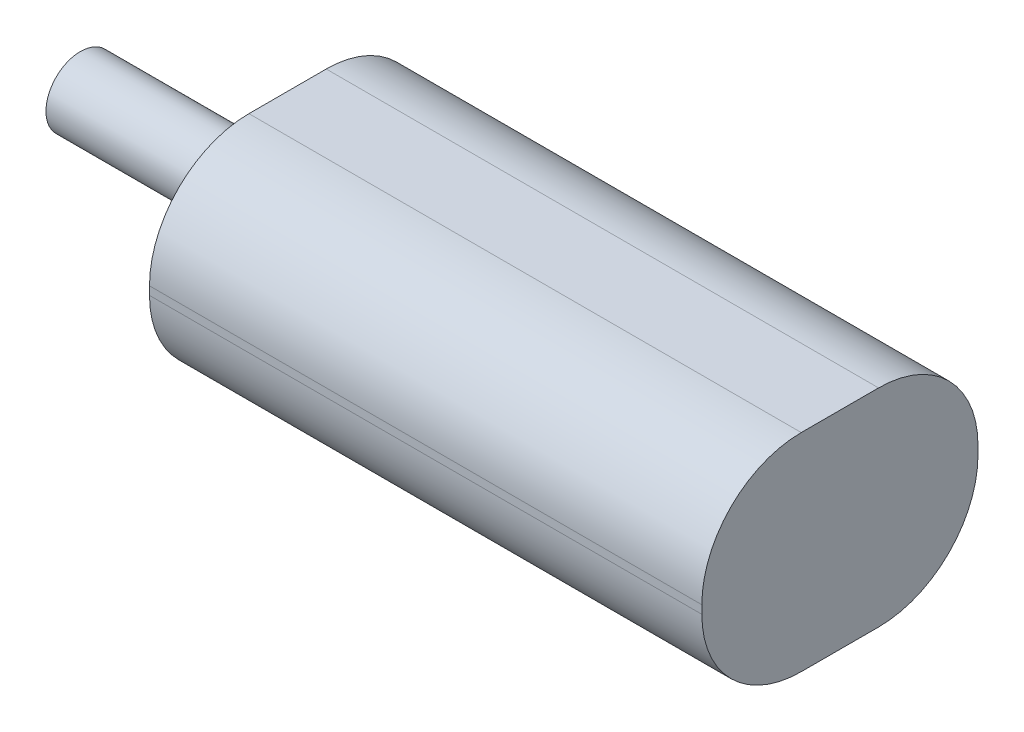
ISO-10303-21;
HEADER;
FILE_DESCRIPTION(('STEP AP214'),'2;1');
FILE_NAME('part.step','',(''),(''),'','','');
FILE_SCHEMA(('AUTOMOTIVE_DESIGN { 1 0 10303 214 1 1 1 1 }'));
ENDSEC;
DATA;
#1=APPLICATION_CONTEXT('core data for automotive mechanical design processes');
#2=APPLICATION_PROTOCOL_DEFINITION('international standard','automotive_design',2000,#1);
#3=PRODUCT_CONTEXT('',#1,'mechanical');
#4=PRODUCT('Part','Part','',(#3));
#5=PRODUCT_RELATED_PRODUCT_CATEGORY('part','',(#4));
#6=PRODUCT_DEFINITION_FORMATION('','',#4);
#7=PRODUCT_DEFINITION_CONTEXT('part definition',#1,'design');
#8=PRODUCT_DEFINITION('design','',#6,#7);
#9=PRODUCT_DEFINITION_SHAPE('','',#8);
#10=(LENGTH_UNIT() NAMED_UNIT(*) SI_UNIT(.MILLI.,.METRE.));
#11=(NAMED_UNIT(*) PLANE_ANGLE_UNIT() SI_UNIT($,.RADIAN.));
#12=(NAMED_UNIT(*) SI_UNIT($,.STERADIAN.) SOLID_ANGLE_UNIT());
#13=UNCERTAINTY_MEASURE_WITH_UNIT(LENGTH_MEASURE(1.E-05),#10,'distance_accuracy_value','');
#14=(GEOMETRIC_REPRESENTATION_CONTEXT(3) GLOBAL_UNCERTAINTY_ASSIGNED_CONTEXT((#13)) GLOBAL_UNIT_ASSIGNED_CONTEXT((#10,
#11,#12)) REPRESENTATION_CONTEXT('',''));
#15=CARTESIAN_POINT('',(0.,0.,0.));
#16=DIRECTION('',(0.,0.,1.));
#17=DIRECTION('',(1.,0.,0.));
#18=AXIS2_PLACEMENT_3D('',#15,#16,#17);
#19=CARTESIAN_POINT('',(0.,9.525,0.));
#20=DIRECTION('',(1.,0.,0.));
#21=DIRECTION('',(0.,0.,-1.));
#22=AXIS2_PLACEMENT_3D('',#19,#20,#21);
#23=PLANE('',#22);
#24=CARTESIAN_POINT('',(0.,4.7625,-6.35));
#25=DIRECTION('',(-1.,0.,0.));
#26=DIRECTION('',(0.,0.,1.));
#27=AXIS2_PLACEMENT_3D('',#24,#25,#26);
#28=CIRCLE('',#27,1.5875);
#29=CARTESIAN_POINT('',(0.,4.7625,-7.9375));
#30=VERTEX_POINT('',#29);
#31=EDGE_CURVE('E139',#30,#30,#28,.T.);
#32=ORIENTED_EDGE('',*,*,#31,.F.);
#33=EDGE_LOOP('',(#32));
#34=FACE_BOUND('',#33,.T.);
#35=DIRECTION('',(0.,0.,1.));
#36=VECTOR('',#35,1.);
#37=CARTESIAN_POINT('',(0.,0.,0.));
#38=LINE('',#37,#36);
#39=CARTESIAN_POINT('',(0.,0.,-8.128));
#40=VERTEX_POINT('',#39);
#41=CARTESIAN_POINT('',(0.,0.,-4.572));
#42=VERTEX_POINT('',#41);
#43=EDGE_CURVE('E190',#40,#42,#38,.T.);
#44=ORIENTED_EDGE('',*,*,#43,.T.);
#45=CARTESIAN_POINT('',(0.,4.572,-4.572));
#46=DIRECTION('',(1.,0.,0.));
#47=DIRECTION('',(0.,0.,-1.));
#48=AXIS2_PLACEMENT_3D('',#45,#46,#47);
#49=CIRCLE('',#48,4.572);
#50=CARTESIAN_POINT('',(0.,4.572,0.));
#51=VERTEX_POINT('',#50);
#52=EDGE_CURVE('E168',#42,#51,#49,.F.);
#53=ORIENTED_EDGE('',*,*,#52,.T.);
#54=DIRECTION('',(0.,-1.,0.));
#55=VECTOR('',#54,1.);
#56=CARTESIAN_POINT('',(0.,9.525,0.));
#57=LINE('',#56,#55);
#58=CARTESIAN_POINT('',(0.,4.953,0.));
#59=VERTEX_POINT('',#58);
#60=EDGE_CURVE('E133',#59,#51,#57,.T.);
#61=ORIENTED_EDGE('',*,*,#60,.F.);
#62=CARTESIAN_POINT('',(0.,4.953,-4.572));
#63=DIRECTION('',(1.,0.,0.));
#64=DIRECTION('',(0.,0.,-1.));
#65=AXIS2_PLACEMENT_3D('',#62,#63,#64);
#66=CIRCLE('',#65,4.572);
#67=CARTESIAN_POINT('',(0.,9.525,-4.572));
#68=VERTEX_POINT('',#67);
#69=EDGE_CURVE('E137',#59,#68,#66,.F.);
#70=ORIENTED_EDGE('',*,*,#69,.T.);
#71=DIRECTION('',(0.,0.,1.));
#72=VECTOR('',#71,1.);
#73=CARTESIAN_POINT('',(0.,9.525,0.));
#74=LINE('',#73,#72);
#75=CARTESIAN_POINT('',(0.,9.525,-8.128));
#76=VERTEX_POINT('',#75);
#77=EDGE_CURVE('E181',#76,#68,#74,.T.);
#78=ORIENTED_EDGE('',*,*,#77,.F.);
#79=CARTESIAN_POINT('',(0.,4.953,-8.128));
#80=DIRECTION('',(1.,0.,0.));
#81=DIRECTION('',(0.,0.,-1.));
#82=AXIS2_PLACEMENT_3D('',#79,#80,#81);
#83=CIRCLE('',#82,4.572);
#84=CARTESIAN_POINT('',(0.,4.953,-12.7));
#85=VERTEX_POINT('',#84);
#86=EDGE_CURVE('E67',#76,#85,#83,.F.);
#87=ORIENTED_EDGE('',*,*,#86,.T.);
#88=DIRECTION('',(0.,-1.,0.));
#89=VECTOR('',#88,1.);
#90=CARTESIAN_POINT('',(0.,9.525,-12.7));
#91=LINE('',#90,#89);
#92=CARTESIAN_POINT('',(0.,4.572,-12.7));
#93=VERTEX_POINT('',#92);
#94=EDGE_CURVE('E187',#85,#93,#91,.T.);
#95=ORIENTED_EDGE('',*,*,#94,.T.);
#96=CARTESIAN_POINT('',(0.,4.572,-8.128));
#97=DIRECTION('',(1.,0.,0.));
#98=DIRECTION('',(0.,0.,-1.));
#99=AXIS2_PLACEMENT_3D('',#96,#97,#98);
#100=CIRCLE('',#99,4.572);
#101=EDGE_CURVE('E59',#93,#40,#100,.F.);
#102=ORIENTED_EDGE('',*,*,#101,.T.);
#103=EDGE_LOOP('',(#44,#53,#61,#70,#78,#87,#95,#102));
#104=FACE_BOUND('',#103,.T.);
#105=ADVANCED_FACE('F43',(#34,#104),#23,.F.);
#106=CARTESIAN_POINT('',(0.,9.525,0.));
#107=DIRECTION('',(0.,0.,-1.));
#108=DIRECTION('',(-1.,0.,0.));
#109=AXIS2_PLACEMENT_3D('',#106,#107,#108);
#110=PLANE('',#109);
#111=ORIENTED_EDGE('',*,*,#60,.T.);
#112=DIRECTION('',(1.,0.,0.));
#113=VECTOR('',#112,1.);
#114=CARTESIAN_POINT('',(25.4,4.572,0.));
#115=LINE('',#114,#113);
#116=CARTESIAN_POINT('',(25.4,4.572,0.));
#117=VERTEX_POINT('',#116);
#118=EDGE_CURVE('E123',#51,#117,#115,.T.);
#119=ORIENTED_EDGE('',*,*,#118,.T.);
#120=DIRECTION('',(0.,-1.,0.));
#121=VECTOR('',#120,1.);
#122=CARTESIAN_POINT('',(25.4,9.525,0.));
#123=LINE('',#122,#121);
#124=CARTESIAN_POINT('',(25.4,4.953,0.));
#125=VERTEX_POINT('',#124);
#126=EDGE_CURVE('E114',#125,#117,#123,.T.);
#127=ORIENTED_EDGE('',*,*,#126,.F.);
#128=DIRECTION('',(1.,0.,0.));
#129=VECTOR('',#128,1.);
#130=CARTESIAN_POINT('',(0.,4.953,0.));
#131=LINE('',#130,#129);
#132=EDGE_CURVE('E129',#125,#59,#131,.F.);
#133=ORIENTED_EDGE('',*,*,#132,.T.);
#134=EDGE_LOOP('',(#111,#119,#127,#133));
#135=FACE_BOUND('',#134,.T.);
#136=ADVANCED_FACE('F128',(#135),#110,.F.);
#137=CARTESIAN_POINT('',(25.4,9.525,0.));
#138=DIRECTION('',(-1.,0.,0.));
#139=DIRECTION('',(0.,0.,1.));
#140=AXIS2_PLACEMENT_3D('',#137,#138,#139);
#141=PLANE('',#140);
#142=ORIENTED_EDGE('',*,*,#126,.T.);
#143=CARTESIAN_POINT('',(25.4,4.572,-4.572));
#144=DIRECTION('',(-1.,0.,0.));
#145=DIRECTION('',(0.,0.,1.));
#146=AXIS2_PLACEMENT_3D('',#143,#144,#145);
#147=CIRCLE('',#146,4.572);
#148=CARTESIAN_POINT('',(25.4,0.,-4.572));
#149=VERTEX_POINT('',#148);
#150=EDGE_CURVE('E153',#117,#149,#147,.F.);
#151=ORIENTED_EDGE('',*,*,#150,.T.);
#152=DIRECTION('',(0.,0.,-1.));
#153=VECTOR('',#152,1.);
#154=CARTESIAN_POINT('',(25.4,0.,0.));
#155=LINE('',#154,#153);
#156=CARTESIAN_POINT('',(25.4,0.,-8.128));
#157=VERTEX_POINT('',#156);
#158=EDGE_CURVE('E183',#149,#157,#155,.T.);
#159=ORIENTED_EDGE('',*,*,#158,.T.);
#160=CARTESIAN_POINT('',(25.4,4.572,-8.128));
#161=DIRECTION('',(-1.,0.,0.));
#162=DIRECTION('',(0.,0.,1.));
#163=AXIS2_PLACEMENT_3D('',#160,#161,#162);
#164=CIRCLE('',#163,4.572);
#165=CARTESIAN_POINT('',(25.4,4.572,-12.7));
#166=VERTEX_POINT('',#165);
#167=EDGE_CURVE('E150',#157,#166,#164,.F.);
#168=ORIENTED_EDGE('',*,*,#167,.T.);
#169=DIRECTION('',(0.,-1.,0.));
#170=VECTOR('',#169,1.);
#171=CARTESIAN_POINT('',(25.4,9.525,-12.7));
#172=LINE('',#171,#170);
#173=CARTESIAN_POINT('',(25.4,4.953,-12.7));
#174=VERTEX_POINT('',#173);
#175=EDGE_CURVE('E134',#174,#166,#172,.T.);
#176=ORIENTED_EDGE('',*,*,#175,.F.);
#177=CARTESIAN_POINT('',(25.4,4.953,-8.128));
#178=DIRECTION('',(-1.,0.,0.));
#179=DIRECTION('',(0.,0.,1.));
#180=AXIS2_PLACEMENT_3D('',#177,#178,#179);
#181=CIRCLE('',#180,4.572);
#182=CARTESIAN_POINT('',(25.4,9.525,-8.128));
#183=VERTEX_POINT('',#182);
#184=EDGE_CURVE('E122',#174,#183,#181,.F.);
#185=ORIENTED_EDGE('',*,*,#184,.T.);
#186=DIRECTION('',(0.,0.,-1.));
#187=VECTOR('',#186,1.);
#188=CARTESIAN_POINT('',(25.4,9.525,0.));
#189=LINE('',#188,#187);
#190=CARTESIAN_POINT('',(25.4,9.525,-4.572));
#191=VERTEX_POINT('',#190);
#192=EDGE_CURVE('E116',#191,#183,#189,.T.);
#193=ORIENTED_EDGE('',*,*,#192,.F.);
#194=CARTESIAN_POINT('',(25.4,4.953,-4.572));
#195=DIRECTION('',(-1.,0.,0.));
#196=DIRECTION('',(0.,0.,1.));
#197=AXIS2_PLACEMENT_3D('',#194,#195,#196);
#198=CIRCLE('',#197,4.572);
#199=EDGE_CURVE('E111',#191,#125,#198,.F.);
#200=ORIENTED_EDGE('',*,*,#199,.T.);
#201=EDGE_LOOP('',(#142,#151,#159,#168,#176,#185,#193,#200));
#202=FACE_BOUND('',#201,.T.);
#203=ADVANCED_FACE('F113',(#202),#141,.F.);
#204=CARTESIAN_POINT('',(0.,9.525,-12.7));
#205=DIRECTION('',(0.,0.,1.));
#206=DIRECTION('',(1.,0.,0.));
#207=AXIS2_PLACEMENT_3D('',#204,#205,#206);
#208=PLANE('',#207);
#209=ORIENTED_EDGE('',*,*,#175,.T.);
#210=DIRECTION('',(-1.,0.,0.));
#211=VECTOR('',#210,1.);
#212=CARTESIAN_POINT('',(0.,4.572,-12.7));
#213=LINE('',#212,#211);
#214=EDGE_CURVE('E174',#166,#93,#213,.T.);
#215=ORIENTED_EDGE('',*,*,#214,.T.);
#216=ORIENTED_EDGE('',*,*,#94,.F.);
#217=DIRECTION('',(-1.,0.,0.));
#218=VECTOR('',#217,1.);
#219=CARTESIAN_POINT('',(0.,4.953,-12.7));
#220=LINE('',#219,#218);
#221=EDGE_CURVE('E171',#85,#174,#220,.F.);
#222=ORIENTED_EDGE('',*,*,#221,.T.);
#223=EDGE_LOOP('',(#209,#215,#216,#222));
#224=FACE_BOUND('',#223,.T.);
#225=ADVANCED_FACE('F204',(#224),#208,.F.);
#226=CARTESIAN_POINT('',(0.,9.525,0.));
#227=DIRECTION('',(0.,-1.,0.));
#228=DIRECTION('',(0.,0.,-1.));
#229=AXIS2_PLACEMENT_3D('',#226,#227,#228);
#230=PLANE('',#229);
#231=ORIENTED_EDGE('',*,*,#192,.T.);
#232=DIRECTION('',(-1.,0.,0.));
#233=VECTOR('',#232,1.);
#234=CARTESIAN_POINT('',(0.,9.525,-8.128));
#235=LINE('',#234,#233);
#236=EDGE_CURVE('E11',#183,#76,#235,.T.);
#237=ORIENTED_EDGE('',*,*,#236,.T.);
#238=ORIENTED_EDGE('',*,*,#77,.T.);
#239=DIRECTION('',(1.,0.,0.));
#240=VECTOR('',#239,1.);
#241=CARTESIAN_POINT('',(0.,9.525,-4.572));
#242=LINE('',#241,#240);
#243=EDGE_CURVE('E52',#68,#191,#242,.T.);
#244=ORIENTED_EDGE('',*,*,#243,.T.);
#245=EDGE_LOOP('',(#231,#237,#238,#244));
#246=FACE_BOUND('',#245,.T.);
#247=ADVANCED_FACE('F179',(#246),#230,.F.);
#248=CARTESIAN_POINT('',(0.,0.,0.));
#249=DIRECTION('',(0.,-1.,0.));
#250=DIRECTION('',(0.,0.,-1.));
#251=AXIS2_PLACEMENT_3D('',#248,#249,#250);
#252=PLANE('',#251);
#253=ORIENTED_EDGE('',*,*,#158,.F.);
#254=DIRECTION('',(1.,0.,0.));
#255=VECTOR('',#254,1.);
#256=CARTESIAN_POINT('',(0.,0.,-4.572));
#257=LINE('',#256,#255);
#258=EDGE_CURVE('E159',#149,#42,#257,.F.);
#259=ORIENTED_EDGE('',*,*,#258,.T.);
#260=ORIENTED_EDGE('',*,*,#43,.F.);
#261=DIRECTION('',(-1.,0.,0.));
#262=VECTOR('',#261,1.);
#263=CARTESIAN_POINT('',(25.4,0.,-8.128));
#264=LINE('',#263,#262);
#265=EDGE_CURVE('E156',#40,#157,#264,.F.);
#266=ORIENTED_EDGE('',*,*,#265,.T.);
#267=EDGE_LOOP('',(#253,#259,#260,#266));
#268=FACE_BOUND('',#267,.T.);
#269=ADVANCED_FACE('F212',(#268),#252,.T.);
#270=CARTESIAN_POINT('',(-9.525,4.7625,-6.34999999999999));
#271=DIRECTION('',(1.,0.,0.));
#272=DIRECTION('',(0.,0.,-1.));
#273=AXIS2_PLACEMENT_3D('',#270,#271,#272);
#274=CYLINDRICAL_SURFACE('',#273,1.5875);
#275=CARTESIAN_POINT('',(-9.525,4.7625,-6.34999999999999));
#276=DIRECTION('',(-1.,0.,0.));
#277=DIRECTION('',(0.,0.,1.));
#278=AXIS2_PLACEMENT_3D('',#275,#276,#277);
#279=CIRCLE('',#278,1.5875);
#280=CARTESIAN_POINT('',(-9.525,4.7625,-7.93749999999999));
#281=VERTEX_POINT('',#280);
#282=EDGE_CURVE('E196',#281,#281,#279,.T.);
#283=CARTESIAN_POINT('',(-9.525,4.7625,-7.93749999999999));
#284=CARTESIAN_POINT('',(-9.42578125000001,4.7625,-7.93749999999999));
#285=CARTESIAN_POINT('',(-9.3265625,4.7625,-7.93749999999999));
#286=CARTESIAN_POINT('',(-9.12812500000001,4.7625,-7.93749999999999));
#287=CARTESIAN_POINT('',(-9.02890625000001,4.7625,-7.93749999999999));
#288=CARTESIAN_POINT('',(-8.83046875,4.7625,-7.93749999999999));
#289=CARTESIAN_POINT('',(-8.73125,4.7625,-7.93749999999999));
#290=CARTESIAN_POINT('',(-8.53281250000001,4.7625,-7.93749999999999));
#291=CARTESIAN_POINT('',(-8.43359375000001,4.7625,-7.93749999999999));
#292=CARTESIAN_POINT('',(-8.23515625,4.7625,-7.93749999999999));
#293=CARTESIAN_POINT('',(-8.1359375,4.7625,-7.93749999999999));
#294=CARTESIAN_POINT('',(-7.93750000000001,4.7625,-7.93749999999999));
#295=CARTESIAN_POINT('',(-7.83828125,4.7625,-7.9375));
#296=CARTESIAN_POINT('',(-7.63984375000001,4.7625,-7.9375));
#297=CARTESIAN_POINT('',(-7.540625,4.7625,-7.9375));
#298=CARTESIAN_POINT('',(-7.3421875,4.7625,-7.9375));
#299=CARTESIAN_POINT('',(-7.24296875000001,4.7625,-7.9375));
#300=CARTESIAN_POINT('',(-7.04453125,4.7625,-7.9375));
#301=CARTESIAN_POINT('',(-6.94531250000001,4.7625,-7.9375));
#302=CARTESIAN_POINT('',(-6.74687500000001,4.7625,-7.9375));
#303=CARTESIAN_POINT('',(-6.64765625000001,4.7625,-7.9375));
#304=CARTESIAN_POINT('',(-6.44921875000001,4.7625,-7.9375));
#305=CARTESIAN_POINT('',(-6.35000000000001,4.7625,-7.9375));
#306=CARTESIAN_POINT('',(-6.15156250000001,4.7625,-7.9375));
#307=CARTESIAN_POINT('',(-6.05234375000001,4.7625,-7.9375));
#308=CARTESIAN_POINT('',(-5.85390625,4.7625,-7.9375));
#309=CARTESIAN_POINT('',(-5.75468750000001,4.7625,-7.9375));
#310=CARTESIAN_POINT('',(-5.55625000000001,4.7625,-7.9375));
#311=CARTESIAN_POINT('',(-5.45703125000001,4.7625,-7.9375));
#312=CARTESIAN_POINT('',(-5.25859375000001,4.7625,-7.9375));
#313=CARTESIAN_POINT('',(-5.15937500000001,4.7625,-7.9375));
#314=CARTESIAN_POINT('',(-4.96093750000001,4.7625,-7.9375));
#315=CARTESIAN_POINT('',(-4.86171875000001,4.7625,-7.9375));
#316=CARTESIAN_POINT('',(-4.66328125000001,4.7625,-7.9375));
#317=CARTESIAN_POINT('',(-4.56406250000001,4.7625,-7.9375));
#318=CARTESIAN_POINT('',(-4.365625,4.7625,-7.9375));
#319=CARTESIAN_POINT('',(-4.26640625000001,4.7625,-7.9375));
#320=CARTESIAN_POINT('',(-4.06796875000001,4.7625,-7.9375));
#321=CARTESIAN_POINT('',(-3.96875000000001,4.7625,-7.9375));
#322=CARTESIAN_POINT('',(-3.77031250000001,4.7625,-7.9375));
#323=CARTESIAN_POINT('',(-3.67109375000001,4.7625,-7.9375));
#324=CARTESIAN_POINT('',(-3.47265625000001,4.7625,-7.9375));
#325=CARTESIAN_POINT('',(-3.37343750000001,4.7625,-7.9375));
#326=CARTESIAN_POINT('',(-3.17500000000001,4.7625,-7.9375));
#327=CARTESIAN_POINT('',(-3.07578125000001,4.7625,-7.9375));
#328=CARTESIAN_POINT('',(-2.87734375000001,4.7625,-7.9375));
#329=CARTESIAN_POINT('',(-2.77812500000001,4.7625,-7.9375));
#330=CARTESIAN_POINT('',(-2.57968750000001,4.7625,-7.9375));
#331=CARTESIAN_POINT('',(-2.48046875,4.7625,-7.9375));
#332=CARTESIAN_POINT('',(-2.28203125000001,4.7625,-7.9375));
#333=CARTESIAN_POINT('',(-2.18281250000001,4.7625,-7.9375));
#334=CARTESIAN_POINT('',(-1.98437500000001,4.7625,-7.9375));
#335=CARTESIAN_POINT('',(-1.88515625000001,4.7625,-7.9375));
#336=CARTESIAN_POINT('',(-1.68671875000001,4.7625,-7.9375));
#337=CARTESIAN_POINT('',(-1.58750000000001,4.7625,-7.9375));
#338=CARTESIAN_POINT('',(-1.38906250000001,4.7625,-7.9375));
#339=CARTESIAN_POINT('',(-1.28984375000001,4.7625,-7.9375));
#340=CARTESIAN_POINT('',(-1.09140625000001,4.7625,-7.9375));
#341=CARTESIAN_POINT('',(-0.992187500000006,4.7625,-7.9375));
#342=CARTESIAN_POINT('',(-0.793750000000006,4.7625,-7.9375));
#343=CARTESIAN_POINT('',(-0.694531250000006,4.7625,-7.9375));
#344=CARTESIAN_POINT('',(-0.496093750000006,4.7625,-7.9375));
#345=CARTESIAN_POINT('',(-0.396875000000005,4.7625,-7.9375));
#346=CARTESIAN_POINT('',(-0.198437500000005,4.7625,-7.9375));
#347=CARTESIAN_POINT('',(-0.0992187500000053,4.7625,-7.9375));
#348=CARTESIAN_POINT('',(0.,4.7625,-7.9375));
#349=B_SPLINE_CURVE_WITH_KNOTS('',3,(#283,#284,#285,#286,#287,#288,#289,#290,#291,#292,#293,
#294,#295,#296,#297,#298,#299,#300,#301,#302,#303,#304,#305,#306,#307,#308,#309,#310,#311,#312,
#313,#314,#315,#316,#317,#318,#319,#320,#321,#322,#323,#324,#325,#326,#327,#328,#329,#330,#331,
#332,#333,#334,#335,#336,#337,#338,#339,#340,#341,#342,#343,#344,#345,#346,#347,#348),
.UNSPECIFIED.,.F.,.F.,(4,2,2,2,2,2,2,2,2,2,2,2,2,2,2,2,2,2,2,2,2,2,2,2,2,2,2,2,2,2,2,2,4),(0.,
0.297656249999998,0.595312499999999,0.892968749999999,1.190625,1.48828125,1.7859375,2.08359375,
2.38125,2.67890625,2.9765625,3.27421875,3.571875,3.86953125,4.1671875,4.46484375,4.7625,
5.06015625,5.3578125,5.65546875,5.953125,6.25078125,6.5484375,6.84609375,7.14375,7.44140625,
7.7390625,8.03671875,8.334375,8.63203125,8.9296875,9.22734375,9.525),.UNSPECIFIED.);
#350=EDGE_CURVE('BSEAM241',#281,#30,#349,.T.);
#351=ORIENTED_EDGE('',*,*,#282,.F.);
#352=ORIENTED_EDGE('',*,*,#31,.T.);
#353=ORIENTED_EDGE('',*,*,#350,.T.);
#354=ORIENTED_EDGE('',*,*,#350,.F.);
#355=EDGE_LOOP('',(#351,#353,#352,#354));
#356=FACE_BOUND('',#355,.T.);
#357=ADVANCED_FACE('F241',(#356),#274,.T.);
#358=CARTESIAN_POINT('',(-9.525,4.7625,-6.34999999999999));
#359=DIRECTION('',(-1.,0.,0.));
#360=DIRECTION('',(0.,0.,1.));
#361=AXIS2_PLACEMENT_3D('',#358,#359,#360);
#362=PLANE('',#361);
#363=ORIENTED_EDGE('',*,*,#282,.T.);
#364=EDGE_LOOP('',(#363));
#365=FACE_BOUND('',#364,.T.);
#366=ADVANCED_FACE('F237',(#365),#362,.T.);
#367=CARTESIAN_POINT('',(0.,4.572,-4.572));
#368=DIRECTION('',(-1.,0.,0.));
#369=DIRECTION('',(0.,0.,1.));
#370=AXIS2_PLACEMENT_3D('',#367,#368,#369);
#371=CYLINDRICAL_SURFACE('',#370,4.572);
#372=ORIENTED_EDGE('',*,*,#52,.F.);
#373=ORIENTED_EDGE('',*,*,#258,.F.);
#374=ORIENTED_EDGE('',*,*,#150,.F.);
#375=ORIENTED_EDGE('',*,*,#118,.F.);
#376=EDGE_LOOP('',(#372,#373,#374,#375));
#377=FACE_BOUND('',#376,.T.);
#378=ADVANCED_FACE('F216',(#377),#371,.T.);
#379=CARTESIAN_POINT('',(0.,4.572,-8.128));
#380=DIRECTION('',(1.,0.,0.));
#381=DIRECTION('',(0.,0.,-1.));
#382=AXIS2_PLACEMENT_3D('',#379,#380,#381);
#383=CYLINDRICAL_SURFACE('',#382,4.572);
#384=ORIENTED_EDGE('',*,*,#167,.F.);
#385=ORIENTED_EDGE('',*,*,#265,.F.);
#386=ORIENTED_EDGE('',*,*,#101,.F.);
#387=ORIENTED_EDGE('',*,*,#214,.F.);
#388=EDGE_LOOP('',(#384,#385,#386,#387));
#389=FACE_BOUND('',#388,.T.);
#390=ADVANCED_FACE('F208',(#389),#383,.T.);
#391=CARTESIAN_POINT('',(0.,4.953,-8.128));
#392=DIRECTION('',(-1.,0.,0.));
#393=DIRECTION('',(0.,0.,1.));
#394=AXIS2_PLACEMENT_3D('',#391,#392,#393);
#395=CYLINDRICAL_SURFACE('',#394,4.572);
#396=ORIENTED_EDGE('',*,*,#184,.F.);
#397=ORIENTED_EDGE('',*,*,#221,.F.);
#398=ORIENTED_EDGE('',*,*,#86,.F.);
#399=ORIENTED_EDGE('',*,*,#236,.F.);
#400=EDGE_LOOP('',(#396,#397,#398,#399));
#401=FACE_BOUND('',#400,.T.);
#402=ADVANCED_FACE('F219',(#401),#395,.T.);
#403=CARTESIAN_POINT('',(0.,4.953,-4.572));
#404=DIRECTION('',(1.,0.,0.));
#405=DIRECTION('',(0.,0.,-1.));
#406=AXIS2_PLACEMENT_3D('',#403,#404,#405);
#407=CYLINDRICAL_SURFACE('',#406,4.572);
#408=ORIENTED_EDGE('',*,*,#69,.F.);
#409=ORIENTED_EDGE('',*,*,#132,.F.);
#410=ORIENTED_EDGE('',*,*,#199,.F.);
#411=ORIENTED_EDGE('',*,*,#243,.F.);
#412=EDGE_LOOP('',(#408,#409,#410,#411));
#413=FACE_BOUND('',#412,.T.);
#414=ADVANCED_FACE('F45',(#413),#407,.T.);
#415=CLOSED_SHELL('',(#105,#136,#203,#225,#247,#269,#357,#366,#378,#390,#402,#414));
#416=MANIFOLD_SOLID_BREP('B2',#415);
#417=ADVANCED_BREP_SHAPE_REPRESENTATION('',(#18,#416),#14);
#418=SHAPE_DEFINITION_REPRESENTATION(#9,#417);
ENDSEC;
END-ISO-10303-21;
